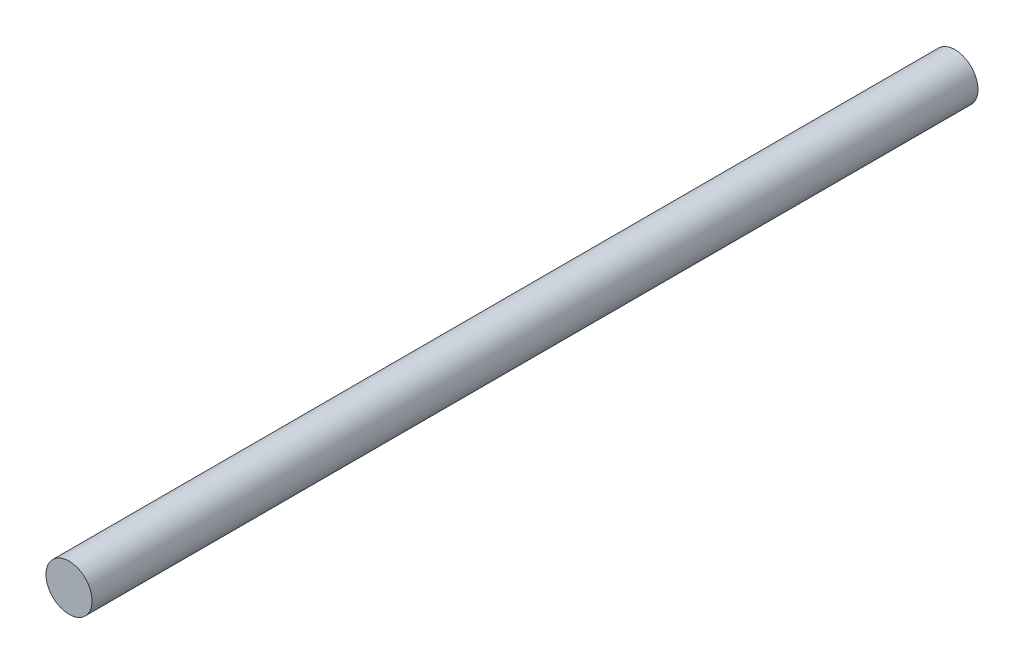
ISO-10303-21;
HEADER;
FILE_DESCRIPTION(('STEP AP214'),'2;1');
FILE_NAME('part.step','',(''),(''),'','','');
FILE_SCHEMA(('AUTOMOTIVE_DESIGN { 1 0 10303 214 1 1 1 1 }'));
ENDSEC;
DATA;
#1=APPLICATION_CONTEXT('core data for automotive mechanical design processes');
#2=APPLICATION_PROTOCOL_DEFINITION('international standard','automotive_design',2000,#1);
#3=PRODUCT_CONTEXT('',#1,'mechanical');
#4=PRODUCT('Part','Part','',(#3));
#5=PRODUCT_RELATED_PRODUCT_CATEGORY('part','',(#4));
#6=PRODUCT_DEFINITION_FORMATION('','',#4);
#7=PRODUCT_DEFINITION_CONTEXT('part definition',#1,'design');
#8=PRODUCT_DEFINITION('design','',#6,#7);
#9=PRODUCT_DEFINITION_SHAPE('','',#8);
#10=(LENGTH_UNIT() NAMED_UNIT(*) SI_UNIT(.MILLI.,.METRE.));
#11=(NAMED_UNIT(*) PLANE_ANGLE_UNIT() SI_UNIT($,.RADIAN.));
#12=(NAMED_UNIT(*) SI_UNIT($,.STERADIAN.) SOLID_ANGLE_UNIT());
#13=UNCERTAINTY_MEASURE_WITH_UNIT(LENGTH_MEASURE(1.E-05),#10,'distance_accuracy_value','');
#14=(GEOMETRIC_REPRESENTATION_CONTEXT(3) GLOBAL_UNCERTAINTY_ASSIGNED_CONTEXT((#13)) GLOBAL_UNIT_ASSIGNED_CONTEXT((#10,
#11,#12)) REPRESENTATION_CONTEXT('',''));
#15=CARTESIAN_POINT('',(0.,0.,0.));
#16=DIRECTION('',(0.,0.,1.));
#17=DIRECTION('',(1.,0.,0.));
#18=AXIS2_PLACEMENT_3D('',#15,#16,#17);
#19=CARTESIAN_POINT('',(0.,0.,48.));
#20=DIRECTION('',(0.,0.,-1.));
#21=DIRECTION('',(-1.,0.,0.));
#22=AXIS2_PLACEMENT_3D('',#19,#20,#21);
#23=CYLINDRICAL_SURFACE('',#22,2.5);
#24=CARTESIAN_POINT('',(0.,0.,48.));
#25=DIRECTION('',(0.,0.,1.));
#26=DIRECTION('',(1.,0.,0.));
#27=AXIS2_PLACEMENT_3D('',#24,#25,#26);
#28=CIRCLE('',#27,2.5);
#29=CARTESIAN_POINT('',(2.5,0.,48.));
#30=VERTEX_POINT('',#29);
#31=EDGE_CURVE('E10',#30,#30,#28,.T.);
#32=ORIENTED_EDGE('',*,*,#31,.F.);
#33=EDGE_LOOP('',(#32));
#34=FACE_BOUND('',#33,.T.);
#35=CARTESIAN_POINT('',(0.,0.,-48.));
#36=DIRECTION('',(0.,0.,1.));
#37=DIRECTION('',(1.,0.,0.));
#38=AXIS2_PLACEMENT_3D('',#35,#36,#37);
#39=CIRCLE('',#38,2.5);
#40=CARTESIAN_POINT('',(2.5,0.,-48.));
#41=VERTEX_POINT('',#40);
#42=EDGE_CURVE('E40',#41,#41,#39,.T.);
#43=ORIENTED_EDGE('',*,*,#42,.T.);
#44=EDGE_LOOP('',(#43));
#45=FACE_BOUND('',#44,.T.);
#46=ADVANCED_FACE('F37',(#34,#45),#23,.T.);
#47=CARTESIAN_POINT('',(0.,0.,48.));
#48=DIRECTION('',(0.,0.,1.));
#49=DIRECTION('',(1.,0.,0.));
#50=AXIS2_PLACEMENT_3D('',#47,#48,#49);
#51=PLANE('',#50);
#52=ORIENTED_EDGE('',*,*,#31,.T.);
#53=EDGE_LOOP('',(#52));
#54=FACE_BOUND('',#53,.T.);
#55=ADVANCED_FACE('F54',(#54),#51,.T.);
#56=CARTESIAN_POINT('',(0.,0.,-48.));
#57=DIRECTION('',(0.,0.,1.));
#58=DIRECTION('',(1.,0.,0.));
#59=AXIS2_PLACEMENT_3D('',#56,#57,#58);
#60=PLANE('',#59);
#61=ORIENTED_EDGE('',*,*,#42,.F.);
#62=EDGE_LOOP('',(#61));
#63=FACE_BOUND('',#62,.T.);
#64=ADVANCED_FACE('F52',(#63),#60,.F.);
#65=CLOSED_SHELL('',(#46,#55,#64));
#66=MANIFOLD_SOLID_BREP('B2',#65);
#67=ADVANCED_BREP_SHAPE_REPRESENTATION('',(#18,#66),#14);
#68=SHAPE_DEFINITION_REPRESENTATION(#9,#67);
ENDSEC;
END-ISO-10303-21;
